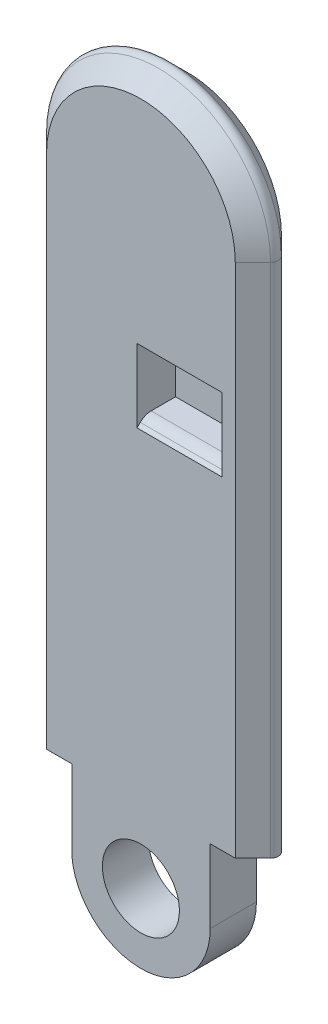
ISO-10303-21;
HEADER;
FILE_DESCRIPTION(('STEP AP214'),'2;1');
FILE_NAME('part.step','',(''),(''),'','','');
FILE_SCHEMA(('AUTOMOTIVE_DESIGN { 1 0 10303 214 1 1 1 1 }'));
ENDSEC;
DATA;
#1=APPLICATION_CONTEXT('core data for automotive mechanical design processes');
#2=APPLICATION_PROTOCOL_DEFINITION('international standard','automotive_design',2000,#1);
#3=PRODUCT_CONTEXT('',#1,'mechanical');
#4=PRODUCT('Part','Part','',(#3));
#5=PRODUCT_RELATED_PRODUCT_CATEGORY('part','',(#4));
#6=PRODUCT_DEFINITION_FORMATION('','',#4);
#7=PRODUCT_DEFINITION_CONTEXT('part definition',#1,'design');
#8=PRODUCT_DEFINITION('design','',#6,#7);
#9=PRODUCT_DEFINITION_SHAPE('','',#8);
#10=(LENGTH_UNIT() NAMED_UNIT(*) SI_UNIT(.MILLI.,.METRE.));
#11=(NAMED_UNIT(*) PLANE_ANGLE_UNIT() SI_UNIT($,.RADIAN.));
#12=(NAMED_UNIT(*) SI_UNIT($,.STERADIAN.) SOLID_ANGLE_UNIT());
#13=UNCERTAINTY_MEASURE_WITH_UNIT(LENGTH_MEASURE(1.E-05),#10,'distance_accuracy_value','');
#14=(GEOMETRIC_REPRESENTATION_CONTEXT(3) GLOBAL_UNCERTAINTY_ASSIGNED_CONTEXT((#13)) GLOBAL_UNIT_ASSIGNED_CONTEXT((#10,
#11,#12)) REPRESENTATION_CONTEXT('',''));
#15=CARTESIAN_POINT('',(0.,0.,0.));
#16=DIRECTION('',(0.,0.,1.));
#17=DIRECTION('',(1.,0.,0.));
#18=AXIS2_PLACEMENT_3D('',#15,#16,#17);
#19=CARTESIAN_POINT('',(0.,0.,-6.));
#20=DIRECTION('',(0.,0.,1.));
#21=DIRECTION('',(1.,0.,0.));
#22=AXIS2_PLACEMENT_3D('',#19,#20,#21);
#23=PLANE('',#22);
#24=CARTESIAN_POINT('',(0.,-43.030823628885,-6.));
#25=DIRECTION('',(0.,0.,1.));
#26=DIRECTION('',(1.,0.,0.));
#27=AXIS2_PLACEMENT_3D('',#24,#25,#26);
#28=CIRCLE('',#27,5.);
#29=CARTESIAN_POINT('',(5.,-43.030823628885,-6.));
#30=VERTEX_POINT('',#29);
#31=EDGE_CURVE('E272',#30,#30,#28,.T.);
#32=ORIENTED_EDGE('',*,*,#31,.T.);
#33=EDGE_LOOP('',(#32));
#34=FACE_BOUND('',#33,.T.);
#35=CARTESIAN_POINT('',(0.,33.5,-6.));
#36=DIRECTION('',(0.,0.,1.));
#37=DIRECTION('',(1.,0.,0.));
#38=AXIS2_PLACEMENT_3D('',#35,#36,#37);
#39=CIRCLE('',#38,12.25);
#40=CARTESIAN_POINT('',(-12.25,33.5,-6.));
#41=VERTEX_POINT('',#40);
#42=CARTESIAN_POINT('',(12.25,33.5,-6.));
#43=VERTEX_POINT('',#42);
#44=EDGE_CURVE('E359',#41,#43,#39,.F.);
#45=ORIENTED_EDGE('',*,*,#44,.T.);
#46=DIRECTION('',(0.,-1.,0.));
#47=VECTOR('',#46,1.);
#48=CARTESIAN_POINT('',(12.25,0.,-6.));
#49=LINE('',#48,#47);
#50=CARTESIAN_POINT('',(12.25,-33.5,-6.));
#51=VERTEX_POINT('',#50);
#52=EDGE_CURVE('E361',#43,#51,#49,.T.);
#53=ORIENTED_EDGE('',*,*,#52,.T.);
#54=DIRECTION('',(1.,0.,0.));
#55=VECTOR('',#54,1.);
#56=CARTESIAN_POINT('',(0.,-33.5,-6.));
#57=LINE('',#56,#55);
#58=CARTESIAN_POINT('',(9.00000000000001,-33.5,-6.));
#59=VERTEX_POINT('',#58);
#60=EDGE_CURVE('E353',#59,#51,#57,.T.);
#61=ORIENTED_EDGE('',*,*,#60,.F.);
#62=DIRECTION('',(0.,1.,0.));
#63=VECTOR('',#62,1.);
#64=CARTESIAN_POINT('',(9.,0.,-6.));
#65=LINE('',#64,#63);
#66=CARTESIAN_POINT('',(9.00000000000001,-43.030823628885,-6.));
#67=VERTEX_POINT('',#66);
#68=EDGE_CURVE('E270',#67,#59,#65,.T.);
#69=ORIENTED_EDGE('',*,*,#68,.F.);
#70=CARTESIAN_POINT('',(0.,-43.030823628885,-6.));
#71=DIRECTION('',(0.,0.,1.));
#72=DIRECTION('',(1.,0.,0.));
#73=AXIS2_PLACEMENT_3D('',#70,#71,#72);
#74=CIRCLE('',#73,9.);
#75=CARTESIAN_POINT('',(-8.97468464942043,-43.7053867789735,-6.));
#76=VERTEX_POINT('',#75);
#77=EDGE_CURVE('E266',#76,#67,#74,.T.);
#78=ORIENTED_EDGE('',*,*,#77,.F.);
#79=DIRECTION('',(0.,-1.,0.));
#80=VECTOR('',#79,1.);
#81=CARTESIAN_POINT('',(-8.97468464942044,0.,-6.));
#82=LINE('',#81,#80);
#83=CARTESIAN_POINT('',(-8.97468464942043,-33.5,-6.));
#84=VERTEX_POINT('',#83);
#85=EDGE_CURVE('E263',#84,#76,#82,.T.);
#86=ORIENTED_EDGE('',*,*,#85,.F.);
#87=CARTESIAN_POINT('',(-12.25,-33.5,-6.));
#88=VERTEX_POINT('',#87);
#89=EDGE_CURVE('E349',#88,#84,#57,.T.);
#90=ORIENTED_EDGE('',*,*,#89,.F.);
#91=DIRECTION('',(0.,1.,0.));
#92=VECTOR('',#91,1.);
#93=CARTESIAN_POINT('',(-12.25,33.5,-6.));
#94=LINE('',#93,#92);
#95=EDGE_CURVE('E352',#88,#41,#94,.T.);
#96=ORIENTED_EDGE('',*,*,#95,.T.);
#97=EDGE_LOOP('',(#45,#53,#61,#69,#78,#86,#90,#96));
#98=FACE_BOUND('',#97,.T.);
#99=DIRECTION('',(0.,-1.,0.));
#100=VECTOR('',#99,1.);
#101=CARTESIAN_POINT('',(-1.5,-31.2388673363516,-6.));
#102=LINE('',#101,#100);
#103=CARTESIAN_POINT('',(-1.5,-24.2388673363516,-6.));
#104=VERTEX_POINT('',#103);
#105=CARTESIAN_POINT('',(-1.5,-31.2388673363516,-6.));
#106=VERTEX_POINT('',#105);
#107=EDGE_CURVE('E307',#104,#106,#102,.T.);
#108=ORIENTED_EDGE('',*,*,#107,.F.);
#109=DIRECTION('',(-1.,0.,0.));
#110=VECTOR('',#109,1.);
#111=CARTESIAN_POINT('',(0.,-24.2388673363516,-6.));
#112=LINE('',#111,#110);
#113=CARTESIAN_POINT('',(-10.5,-24.2388673363516,-6.));
#114=VERTEX_POINT('',#113);
#115=EDGE_CURVE('E418',#104,#114,#112,.T.);
#116=ORIENTED_EDGE('',*,*,#115,.T.);
#117=DIRECTION('',(0.,1.,0.));
#118=VECTOR('',#117,1.);
#119=CARTESIAN_POINT('',(-10.5,-31.2388673363516,-6.));
#120=LINE('',#119,#118);
#121=CARTESIAN_POINT('',(-10.5,-31.2388673363516,-6.));
#122=VERTEX_POINT('',#121);
#123=EDGE_CURVE('E285',#122,#114,#120,.T.);
#124=ORIENTED_EDGE('',*,*,#123,.F.);
#125=DIRECTION('',(-1.,0.,0.));
#126=VECTOR('',#125,1.);
#127=CARTESIAN_POINT('',(-1.5,-31.2388673363516,-6.));
#128=LINE('',#127,#126);
#129=EDGE_CURVE('E296',#106,#122,#128,.T.);
#130=ORIENTED_EDGE('',*,*,#129,.F.);
#131=EDGE_LOOP('',(#108,#116,#124,#130));
#132=FACE_BOUND('',#131,.T.);
#133=DIRECTION('',(1.,0.,0.));
#134=VECTOR('',#133,1.);
#135=CARTESIAN_POINT('',(0.,15.,-6.));
#136=LINE('',#135,#134);
#137=CARTESIAN_POINT('',(0.500000000000004,15.,-6.));
#138=VERTEX_POINT('',#137);
#139=CARTESIAN_POINT('',(4.5,15.,-6.));
#140=VERTEX_POINT('',#139);
#141=EDGE_CURVE('E252',#138,#140,#136,.T.);
#142=ORIENTED_EDGE('',*,*,#141,.F.);
#143=DIRECTION('',(0.,-1.,0.));
#144=VECTOR('',#143,1.);
#145=CARTESIAN_POINT('',(0.500000000000004,0.,-6.));
#146=LINE('',#145,#144);
#147=CARTESIAN_POINT('',(0.500000000000004,8.99999999999999,-6.));
#148=VERTEX_POINT('',#147);
#149=EDGE_CURVE('E248',#138,#148,#146,.T.);
#150=ORIENTED_EDGE('',*,*,#149,.T.);
#151=DIRECTION('',(1.,0.,0.));
#152=VECTOR('',#151,1.);
#153=CARTESIAN_POINT('',(0.,8.99999999999999,-6.));
#154=LINE('',#153,#152);
#155=CARTESIAN_POINT('',(4.5,8.99999999999999,-6.));
#156=VERTEX_POINT('',#155);
#157=EDGE_CURVE('E640',#148,#156,#154,.T.);
#158=ORIENTED_EDGE('',*,*,#157,.T.);
#159=DIRECTION('',(0.,-1.,0.));
#160=VECTOR('',#159,1.);
#161=CARTESIAN_POINT('',(4.5,0.,-6.));
#162=LINE('',#161,#160);
#163=EDGE_CURVE('E642',#140,#156,#162,.T.);
#164=ORIENTED_EDGE('',*,*,#163,.F.);
#165=EDGE_LOOP('',(#142,#150,#158,#164));
#166=FACE_BOUND('',#165,.T.);
#167=ADVANCED_FACE('F45',(#34,#98,#132,#166),#23,.F.);
#168=CARTESIAN_POINT('',(0.,-33.5,-6.));
#169=DIRECTION('',(0.,-1.,0.));
#170=DIRECTION('',(0.,0.,-1.));
#171=AXIS2_PLACEMENT_3D('',#168,#169,#170);
#172=PLANE('',#171);
#173=ORIENTED_EDGE('',*,*,#89,.T.);
#174=DIRECTION('',(0.,0.,1.));
#175=VECTOR('',#174,1.);
#176=CARTESIAN_POINT('',(-8.97468464942043,-33.5,-6.));
#177=LINE('',#176,#175);
#178=CARTESIAN_POINT('',(-8.97468464942043,-33.5,0.));
#179=VERTEX_POINT('',#178);
#180=EDGE_CURVE('E274',#84,#179,#177,.T.);
#181=ORIENTED_EDGE('',*,*,#180,.T.);
#182=DIRECTION('',(1.,0.,0.));
#183=VECTOR('',#182,1.);
#184=CARTESIAN_POINT('',(0.,-33.5,0.));
#185=LINE('',#184,#183);
#186=CARTESIAN_POINT('',(-12.25,-33.5,0.));
#187=VERTEX_POINT('',#186);
#188=EDGE_CURVE('E354',#187,#179,#185,.T.);
#189=ORIENTED_EDGE('',*,*,#188,.F.);
#190=DIRECTION('',(0.707106781186546,0.,0.707106781186549));
#191=VECTOR('',#190,1.);
#192=CARTESIAN_POINT('',(-9.12500000000002,-33.5,3.12499999999998));
#193=LINE('',#192,#191);
#194=CARTESIAN_POINT('',(-14.5428932188134,-33.5,-2.29289321881345));
#195=VERTEX_POINT('',#194);
#196=EDGE_CURVE('E364',#187,#195,#193,.F.);
#197=ORIENTED_EDGE('',*,*,#196,.T.);
#198=CARTESIAN_POINT('',(-13.8357864376269,-33.5,-3.));
#199=DIRECTION('',(0.,-1.,0.));
#200=DIRECTION('',(0.,0.,-1.));
#201=AXIS2_PLACEMENT_3D('',#198,#199,#200);
#202=CIRCLE('',#201,1.);
#203=CARTESIAN_POINT('',(-14.5428932188134,-33.5,-3.70710678118655));
#204=VERTEX_POINT('',#203);
#205=EDGE_CURVE('E397',#195,#204,#202,.T.);
#206=ORIENTED_EDGE('',*,*,#205,.T.);
#207=DIRECTION('',(0.707106781186548,0.,-0.707106781186548));
#208=VECTOR('',#207,1.);
#209=CARTESIAN_POINT('',(-6.12499999999999,-33.5,-12.125));
#210=LINE('',#209,#208);
#211=EDGE_CURVE('E367',#204,#88,#210,.T.);
#212=ORIENTED_EDGE('',*,*,#211,.T.);
#213=EDGE_LOOP('',(#173,#181,#189,#197,#206,#212));
#214=FACE_BOUND('',#213,.T.);
#215=ADVANCED_FACE('F468',(#214),#172,.T.);
#216=DIRECTION('',(0.,0.,1.));
#217=VECTOR('',#216,1.);
#218=CARTESIAN_POINT('',(9.00000000000001,-33.5,-6.));
#219=LINE('',#218,#217);
#220=CARTESIAN_POINT('',(9.00000000000001,-33.5,0.));
#221=VERTEX_POINT('',#220);
#222=EDGE_CURVE('E283',#59,#221,#219,.T.);
#223=ORIENTED_EDGE('',*,*,#222,.F.);
#224=ORIENTED_EDGE('',*,*,#60,.T.);
#225=DIRECTION('',(-0.707106781186548,0.,-0.707106781186548));
#226=VECTOR('',#225,1.);
#227=CARTESIAN_POINT('',(6.12499999999999,-33.5,-12.125));
#228=LINE('',#227,#226);
#229=CARTESIAN_POINT('',(14.5428932188134,-33.5,-3.70710678118654));
#230=VERTEX_POINT('',#229);
#231=EDGE_CURVE('E372',#51,#230,#228,.F.);
#232=ORIENTED_EDGE('',*,*,#231,.T.);
#233=CARTESIAN_POINT('',(13.8357864376269,-33.5,-3.));
#234=DIRECTION('',(0.,-1.,0.));
#235=DIRECTION('',(0.,0.,-1.));
#236=AXIS2_PLACEMENT_3D('',#233,#234,#235);
#237=CIRCLE('',#236,1.);
#238=CARTESIAN_POINT('',(14.5428932188134,-33.5,-2.29289321881345));
#239=VERTEX_POINT('',#238);
#240=EDGE_CURVE('E399',#230,#239,#237,.T.);
#241=ORIENTED_EDGE('',*,*,#240,.T.);
#242=DIRECTION('',(-0.707106781186546,0.,0.707106781186549));
#243=VECTOR('',#242,1.);
#244=CARTESIAN_POINT('',(9.12500000000002,-33.5,3.12499999999999));
#245=LINE('',#244,#243);
#246=CARTESIAN_POINT('',(12.25,-33.5,0.));
#247=VERTEX_POINT('',#246);
#248=EDGE_CURVE('E369',#239,#247,#245,.T.);
#249=ORIENTED_EDGE('',*,*,#248,.T.);
#250=EDGE_CURVE('E357',#221,#247,#185,.T.);
#251=ORIENTED_EDGE('',*,*,#250,.F.);
#252=EDGE_LOOP('',(#223,#224,#232,#241,#249,#251));
#253=FACE_BOUND('',#252,.T.);
#254=ADVANCED_FACE('F476',(#253),#172,.T.);
#255=CARTESIAN_POINT('',(0.,0.,0.));
#256=DIRECTION('',(0.,0.,1.));
#257=DIRECTION('',(1.,0.,0.));
#258=AXIS2_PLACEMENT_3D('',#255,#256,#257);
#259=PLANE('',#258);
#260=DIRECTION('',(0.,1.,0.));
#261=VECTOR('',#260,1.);
#262=CARTESIAN_POINT('',(10.5000000000002,9.50000000000041,0.));
#263=LINE('',#262,#261);
#264=CARTESIAN_POINT('',(10.5000000000002,8.50000000000041,0.));
#265=VERTEX_POINT('',#264);
#266=CARTESIAN_POINT('',(10.5000000000002,18.0000000000004,0.));
#267=VERTEX_POINT('',#266);
#268=EDGE_CURVE('E326',#265,#267,#263,.T.);
#269=ORIENTED_EDGE('',*,*,#268,.F.);
#270=DIRECTION('',(-1.,0.,0.));
#271=VECTOR('',#270,1.);
#272=CARTESIAN_POINT('',(-0.499999999999778,8.50000000000041,0.));
#273=LINE('',#272,#271);
#274=CARTESIAN_POINT('',(-0.499999999999778,8.50000000000041,0.));
#275=VERTEX_POINT('',#274);
#276=EDGE_CURVE('E437',#265,#275,#273,.T.);
#277=ORIENTED_EDGE('',*,*,#276,.T.);
#278=DIRECTION('',(0.,-1.,0.));
#279=VECTOR('',#278,1.);
#280=CARTESIAN_POINT('',(-0.49999999999978,15.0000000000004,0.));
#281=LINE('',#280,#279);
#282=CARTESIAN_POINT('',(-0.49999999999978,18.0000000000004,0.));
#283=VERTEX_POINT('',#282);
#284=EDGE_CURVE('E314',#283,#275,#281,.T.);
#285=ORIENTED_EDGE('',*,*,#284,.F.);
#286=DIRECTION('',(1.,0.,0.));
#287=VECTOR('',#286,1.);
#288=CARTESIAN_POINT('',(10.5000000000002,18.0000000000004,0.));
#289=LINE('',#288,#287);
#290=EDGE_CURVE('E429',#283,#267,#289,.T.);
#291=ORIENTED_EDGE('',*,*,#290,.T.);
#292=EDGE_LOOP('',(#269,#277,#285,#291));
#293=FACE_BOUND('',#292,.T.);
#294=ORIENTED_EDGE('',*,*,#188,.T.);
#295=DIRECTION('',(0.,-1.,0.));
#296=VECTOR('',#295,1.);
#297=CARTESIAN_POINT('',(-8.97468464942044,0.,0.));
#298=LINE('',#297,#296);
#299=CARTESIAN_POINT('',(-8.97468464942043,-43.7053867789735,0.));
#300=VERTEX_POINT('',#299);
#301=EDGE_CURVE('E254',#179,#300,#298,.T.);
#302=ORIENTED_EDGE('',*,*,#301,.T.);
#303=CARTESIAN_POINT('',(0.,-43.030823628885,0.));
#304=DIRECTION('',(0.,0.,1.));
#305=DIRECTION('',(1.,0.,0.));
#306=AXIS2_PLACEMENT_3D('',#303,#304,#305);
#307=CIRCLE('',#306,9.);
#308=CARTESIAN_POINT('',(9.00000000000001,-43.030823628885,0.));
#309=VERTEX_POINT('',#308);
#310=EDGE_CURVE('E257',#300,#309,#307,.T.);
#311=ORIENTED_EDGE('',*,*,#310,.T.);
#312=DIRECTION('',(0.,1.,0.));
#313=VECTOR('',#312,1.);
#314=CARTESIAN_POINT('',(9.,0.,0.));
#315=LINE('',#314,#313);
#316=EDGE_CURVE('E278',#309,#221,#315,.T.);
#317=ORIENTED_EDGE('',*,*,#316,.T.);
#318=ORIENTED_EDGE('',*,*,#250,.T.);
#319=DIRECTION('',(0.,1.,0.));
#320=VECTOR('',#319,1.);
#321=CARTESIAN_POINT('',(12.25,33.5,0.));
#322=LINE('',#321,#320);
#323=CARTESIAN_POINT('',(12.25,33.5,0.));
#324=VERTEX_POINT('',#323);
#325=EDGE_CURVE('E380',#247,#324,#322,.T.);
#326=ORIENTED_EDGE('',*,*,#325,.T.);
#327=CARTESIAN_POINT('',(0.,33.5,0.));
#328=DIRECTION('',(0.,0.,1.));
#329=DIRECTION('',(1.,0.,0.));
#330=AXIS2_PLACEMENT_3D('',#327,#328,#329);
#331=CIRCLE('',#330,12.25);
#332=CARTESIAN_POINT('',(-12.25,33.5,0.));
#333=VERTEX_POINT('',#332);
#334=EDGE_CURVE('E377',#324,#333,#331,.T.);
#335=ORIENTED_EDGE('',*,*,#334,.T.);
#336=DIRECTION('',(0.,-1.,0.));
#337=VECTOR('',#336,1.);
#338=CARTESIAN_POINT('',(-12.25,0.,0.));
#339=LINE('',#338,#337);
#340=EDGE_CURVE('E375',#333,#187,#339,.T.);
#341=ORIENTED_EDGE('',*,*,#340,.T.);
#342=EDGE_LOOP('',(#294,#302,#311,#317,#318,#326,#335,#341));
#343=FACE_BOUND('',#342,.T.);
#344=CARTESIAN_POINT('',(0.,-43.030823628885,0.));
#345=DIRECTION('',(0.,0.,1.));
#346=DIRECTION('',(1.,0.,0.));
#347=AXIS2_PLACEMENT_3D('',#344,#345,#346);
#348=CIRCLE('',#347,5.);
#349=CARTESIAN_POINT('',(5.,-43.030823628885,0.));
#350=VERTEX_POINT('',#349);
#351=EDGE_CURVE('E267',#350,#350,#348,.T.);
#352=ORIENTED_EDGE('',*,*,#351,.F.);
#353=EDGE_LOOP('',(#352));
#354=FACE_BOUND('',#353,.T.);
#355=ADVANCED_FACE('F484',(#293,#343,#354),#259,.T.);
#356=CARTESIAN_POINT('',(-12.25,0.,0.));
#357=DIRECTION('',(0.707106781186549,0.,-0.707106781186546));
#358=DIRECTION('',(0.,-1.,0.));
#359=AXIS2_PLACEMENT_3D('',#356,#357,#358);
#360=PLANE('',#359);
#361=DIRECTION('',(0.707106781186546,0.,0.707106781186549));
#362=VECTOR('',#361,1.);
#363=CARTESIAN_POINT('',(-15.75,33.5,-3.50000000000002));
#364=LINE('',#363,#362);
#365=CARTESIAN_POINT('',(-14.5428932188134,33.5,-2.29289321881345));
#366=VERTEX_POINT('',#365);
#367=EDGE_CURVE('E393',#366,#333,#364,.T.);
#368=ORIENTED_EDGE('',*,*,#367,.F.);
#369=DIRECTION('',(0.,1.,0.));
#370=VECTOR('',#369,1.);
#371=CARTESIAN_POINT('',(-14.5428932188134,0.,-2.29289321881345));
#372=LINE('',#371,#370);
#373=EDGE_CURVE('E409',#366,#195,#372,.F.);
#374=ORIENTED_EDGE('',*,*,#373,.T.);
#375=ORIENTED_EDGE('',*,*,#196,.F.);
#376=ORIENTED_EDGE('',*,*,#340,.F.);
#377=EDGE_LOOP('',(#368,#374,#375,#376));
#378=FACE_BOUND('',#377,.T.);
#379=ADVANCED_FACE('F486',(#378),#360,.F.);
#380=CARTESIAN_POINT('',(0.,33.5,0.));
#381=DIRECTION('',(0.,0.,-1.));
#382=DIRECTION('',(-1.,0.,0.));
#383=AXIS2_PLACEMENT_3D('',#380,#381,#382);
#384=CONICAL_SURFACE('',#383,12.25,0.785398163397446);
#385=DIRECTION('',(-0.707106781186546,0.,0.707106781186549));
#386=VECTOR('',#385,1.);
#387=CARTESIAN_POINT('',(15.75,33.5,-3.50000000000002));
#388=LINE('',#387,#386);
#389=CARTESIAN_POINT('',(14.5428932188134,33.5,-2.29289321881345));
#390=VERTEX_POINT('',#389);
#391=EDGE_CURVE('E391',#390,#324,#388,.T.);
#392=ORIENTED_EDGE('',*,*,#391,.F.);
#393=CARTESIAN_POINT('',(0.,33.5,-2.29289321881345));
#394=DIRECTION('',(0.,0.,1.));
#395=DIRECTION('',(1.,0.,0.));
#396=AXIS2_PLACEMENT_3D('',#393,#394,#395);
#397=CIRCLE('',#396,14.5428932188134);
#398=EDGE_CURVE('E405',#390,#366,#397,.T.);
#399=ORIENTED_EDGE('',*,*,#398,.T.);
#400=ORIENTED_EDGE('',*,*,#367,.T.);
#401=ORIENTED_EDGE('',*,*,#334,.F.);
#402=EDGE_LOOP('',(#392,#399,#400,#401));
#403=FACE_BOUND('',#402,.T.);
#404=ADVANCED_FACE('F521',(#403),#384,.T.);
#405=CARTESIAN_POINT('',(-15.75,0.,-2.49999999999998));
#406=DIRECTION('',(-0.707106781186548,0.,-0.707106781186548));
#407=DIRECTION('',(0.,1.,0.));
#408=AXIS2_PLACEMENT_3D('',#405,#406,#407);
#409=PLANE('',#408);
#410=ORIENTED_EDGE('',*,*,#211,.F.);
#411=DIRECTION('',(0.,-1.,0.));
#412=VECTOR('',#411,1.);
#413=CARTESIAN_POINT('',(-14.5428932188134,0.,-3.70710678118654));
#414=LINE('',#413,#412);
#415=CARTESIAN_POINT('',(-14.5428932188134,33.5,-3.70710678118654));
#416=VERTEX_POINT('',#415);
#417=EDGE_CURVE('E407',#204,#416,#414,.F.);
#418=ORIENTED_EDGE('',*,*,#417,.T.);
#419=DIRECTION('',(-0.707106781186548,0.,0.707106781186548));
#420=VECTOR('',#419,1.);
#421=CARTESIAN_POINT('',(-12.25,33.5,-6.));
#422=LINE('',#421,#420);
#423=EDGE_CURVE('E387',#41,#416,#422,.T.);
#424=ORIENTED_EDGE('',*,*,#423,.F.);
#425=ORIENTED_EDGE('',*,*,#95,.F.);
#426=EDGE_LOOP('',(#410,#418,#424,#425));
#427=FACE_BOUND('',#426,.T.);
#428=ADVANCED_FACE('F514',(#427),#409,.T.);
#429=CARTESIAN_POINT('',(15.75,0.,-3.50000000000002));
#430=DIRECTION('',(0.707106781186549,0.,0.707106781186546));
#431=DIRECTION('',(0.,1.,0.));
#432=AXIS2_PLACEMENT_3D('',#429,#430,#431);
#433=PLANE('',#432);
#434=ORIENTED_EDGE('',*,*,#248,.F.);
#435=DIRECTION('',(0.,1.,0.));
#436=VECTOR('',#435,1.);
#437=CARTESIAN_POINT('',(14.5428932188134,0.,-2.29289321881345));
#438=LINE('',#437,#436);
#439=EDGE_CURVE('E401',#239,#390,#438,.T.);
#440=ORIENTED_EDGE('',*,*,#439,.T.);
#441=ORIENTED_EDGE('',*,*,#391,.T.);
#442=ORIENTED_EDGE('',*,*,#325,.F.);
#443=EDGE_LOOP('',(#434,#440,#441,#442));
#444=FACE_BOUND('',#443,.T.);
#445=ADVANCED_FACE('F507',(#444),#433,.T.);
#446=CARTESIAN_POINT('',(0.,33.5,-2.49999999999998));
#447=DIRECTION('',(0.,0.,1.));
#448=DIRECTION('',(1.,0.,0.));
#449=AXIS2_PLACEMENT_3D('',#446,#447,#448);
#450=CONICAL_SURFACE('',#449,15.75,0.785398163397448);
#451=ORIENTED_EDGE('',*,*,#423,.T.);
#452=CARTESIAN_POINT('',(0.,33.5,-3.70710678118655));
#453=DIRECTION('',(0.,0.,-1.));
#454=DIRECTION('',(-1.,0.,0.));
#455=AXIS2_PLACEMENT_3D('',#452,#453,#454);
#456=CIRCLE('',#455,14.5428932188134);
#457=CARTESIAN_POINT('',(14.5428932188134,33.5,-3.70710678118655));
#458=VERTEX_POINT('',#457);
#459=EDGE_CURVE('E403',#416,#458,#456,.T.);
#460=ORIENTED_EDGE('',*,*,#459,.T.);
#461=DIRECTION('',(0.707106781186548,0.,0.707106781186548));
#462=VECTOR('',#461,1.);
#463=CARTESIAN_POINT('',(12.25,33.5,-6.));
#464=LINE('',#463,#462);
#465=EDGE_CURVE('E384',#43,#458,#464,.T.);
#466=ORIENTED_EDGE('',*,*,#465,.F.);
#467=ORIENTED_EDGE('',*,*,#44,.F.);
#468=EDGE_LOOP('',(#451,#460,#466,#467));
#469=FACE_BOUND('',#468,.T.);
#470=ADVANCED_FACE('F500',(#469),#450,.T.);
#471=CARTESIAN_POINT('',(12.25,0.,-6.));
#472=DIRECTION('',(-0.707106781186548,0.,0.707106781186548));
#473=DIRECTION('',(0.,-1.,0.));
#474=AXIS2_PLACEMENT_3D('',#471,#472,#473);
#475=PLANE('',#474);
#476=ORIENTED_EDGE('',*,*,#465,.T.);
#477=DIRECTION('',(0.,-1.,0.));
#478=VECTOR('',#477,1.);
#479=CARTESIAN_POINT('',(14.5428932188134,0.,-3.70710678118654));
#480=LINE('',#479,#478);
#481=EDGE_CURVE('E383',#458,#230,#480,.T.);
#482=ORIENTED_EDGE('',*,*,#481,.T.);
#483=ORIENTED_EDGE('',*,*,#231,.F.);
#484=ORIENTED_EDGE('',*,*,#52,.F.);
#485=EDGE_LOOP('',(#476,#482,#483,#484));
#486=FACE_BOUND('',#485,.T.);
#487=ADVANCED_FACE('F492',(#486),#475,.F.);
#488=CARTESIAN_POINT('',(-13.8357864376269,0.,-3.));
#489=DIRECTION('',(0.,-1.,0.));
#490=DIRECTION('',(1.,0.,0.));
#491=AXIS2_PLACEMENT_3D('',#488,#489,#490);
#492=CYLINDRICAL_SURFACE('',#491,1.);
#493=ORIENTED_EDGE('',*,*,#205,.F.);
#494=ORIENTED_EDGE('',*,*,#373,.F.);
#495=CARTESIAN_POINT('',(-13.8357864376269,33.5,-3.));
#496=DIRECTION('',(0.,1.,0.));
#497=DIRECTION('',(0.,0.,1.));
#498=AXIS2_PLACEMENT_3D('',#495,#496,#497);
#499=CIRCLE('',#498,1.);
#500=EDGE_CURVE('E388',#416,#366,#499,.T.);
#501=ORIENTED_EDGE('',*,*,#500,.F.);
#502=ORIENTED_EDGE('',*,*,#417,.F.);
#503=EDGE_LOOP('',(#493,#494,#501,#502));
#504=FACE_BOUND('',#503,.T.);
#505=ADVANCED_FACE('F499',(#504),#492,.T.);
#506=CARTESIAN_POINT('',(0.,33.5,-3.));
#507=DIRECTION('',(0.,0.,1.));
#508=DIRECTION('',(1.,0.,0.));
#509=AXIS2_PLACEMENT_3D('',#506,#507,#508);
#510=TOROIDAL_SURFACE('',#509,13.8357864376269,1.);
#511=ORIENTED_EDGE('',*,*,#500,.T.);
#512=ORIENTED_EDGE('',*,*,#398,.F.);
#513=CARTESIAN_POINT('',(13.8357864376269,33.5,-3.));
#514=DIRECTION('',(0.,-1.,0.));
#515=DIRECTION('',(0.,0.,-1.));
#516=AXIS2_PLACEMENT_3D('',#513,#514,#515);
#517=CIRCLE('',#516,1.);
#518=EDGE_CURVE('E341',#458,#390,#517,.T.);
#519=ORIENTED_EDGE('',*,*,#518,.F.);
#520=ORIENTED_EDGE('',*,*,#459,.F.);
#521=EDGE_LOOP('',(#511,#512,#519,#520));
#522=FACE_BOUND('',#521,.T.);
#523=ADVANCED_FACE('F537',(#522),#510,.T.);
#524=CARTESIAN_POINT('',(13.8357864376269,0.,-3.));
#525=DIRECTION('',(0.,1.,0.));
#526=DIRECTION('',(-1.,0.,0.));
#527=AXIS2_PLACEMENT_3D('',#524,#525,#526);
#528=CYLINDRICAL_SURFACE('',#527,1.);
#529=ORIENTED_EDGE('',*,*,#518,.T.);
#530=ORIENTED_EDGE('',*,*,#439,.F.);
#531=ORIENTED_EDGE('',*,*,#240,.F.);
#532=ORIENTED_EDGE('',*,*,#481,.F.);
#533=EDGE_LOOP('',(#529,#530,#531,#532));
#534=FACE_BOUND('',#533,.T.);
#535=ADVANCED_FACE('F534',(#534),#528,.T.);
#536=CARTESIAN_POINT('',(-0.49999999999978,15.0000000000004,-5.));
#537=DIRECTION('',(0.,1.,0.));
#538=DIRECTION('',(0.,0.,1.));
#539=AXIS2_PLACEMENT_3D('',#536,#537,#538);
#540=PLANE('',#539);
#541=DIRECTION('',(0.,0.,1.));
#542=VECTOR('',#541,1.);
#543=CARTESIAN_POINT('',(10.5000000000002,15.0000000000004,-5.));
#544=LINE('',#543,#542);
#545=CARTESIAN_POINT('',(10.5000000000002,15.0000000000004,-5.));
#546=VERTEX_POINT('',#545);
#547=CARTESIAN_POINT('',(10.5000000000002,15.0000000000004,-3.));
#548=VERTEX_POINT('',#547);
#549=EDGE_CURVE('E338',#546,#548,#544,.T.);
#550=ORIENTED_EDGE('',*,*,#549,.T.);
#551=DIRECTION('',(-1.,0.,0.));
#552=VECTOR('',#551,1.);
#553=CARTESIAN_POINT('',(-0.49999999999978,15.0000000000004,-3.));
#554=LINE('',#553,#552);
#555=CARTESIAN_POINT('',(-0.49999999999978,15.0000000000004,-3.));
#556=VERTEX_POINT('',#555);
#557=EDGE_CURVE('E426',#548,#556,#554,.T.);
#558=ORIENTED_EDGE('',*,*,#557,.T.);
#559=DIRECTION('',(0.,0.,1.));
#560=VECTOR('',#559,1.);
#561=CARTESIAN_POINT('',(-0.49999999999978,15.0000000000004,-5.));
#562=LINE('',#561,#560);
#563=CARTESIAN_POINT('',(-0.49999999999978,15.0000000000004,-5.));
#564=VERTEX_POINT('',#563);
#565=EDGE_CURVE('E335',#564,#556,#562,.T.);
#566=ORIENTED_EDGE('',*,*,#565,.F.);
#567=DIRECTION('',(-1.,0.,0.));
#568=VECTOR('',#567,1.);
#569=CARTESIAN_POINT('',(-0.49999999999978,15.0000000000004,-5.));
#570=LINE('',#569,#568);
#571=EDGE_CURVE('E322',#546,#564,#570,.T.);
#572=ORIENTED_EDGE('',*,*,#571,.F.);
#573=EDGE_LOOP('',(#550,#558,#566,#572));
#574=FACE_BOUND('',#573,.T.);
#575=ADVANCED_FACE('F482',(#574),#540,.F.);
#576=CARTESIAN_POINT('',(10.5000000000002,9.50000000000041,-5.));
#577=DIRECTION('',(1.,0.,0.));
#578=DIRECTION('',(0.,0.,-1.));
#579=AXIS2_PLACEMENT_3D('',#576,#577,#578);
#580=PLANE('',#579);
#581=ORIENTED_EDGE('',*,*,#268,.T.);
#582=DIRECTION('',(0.,-0.707106781186549,-0.707106781186546));
#583=VECTOR('',#582,1.);
#584=CARTESIAN_POINT('',(10.5000000000002,11.2500000000004,-6.75));
#585=LINE('',#584,#583);
#586=EDGE_CURVE('E435',#267,#548,#585,.T.);
#587=ORIENTED_EDGE('',*,*,#586,.T.);
#588=ORIENTED_EDGE('',*,*,#549,.F.);
#589=DIRECTION('',(0.,1.,0.));
#590=VECTOR('',#589,1.);
#591=CARTESIAN_POINT('',(10.5000000000002,9.50000000000041,-5.));
#592=LINE('',#591,#590);
#593=CARTESIAN_POINT('',(10.5000000000002,9.50000000000041,-5.));
#594=VERTEX_POINT('',#593);
#595=EDGE_CURVE('E332',#594,#546,#592,.T.);
#596=ORIENTED_EDGE('',*,*,#595,.F.);
#597=DIRECTION('',(0.,0.,1.));
#598=VECTOR('',#597,1.);
#599=CARTESIAN_POINT('',(10.5000000000002,9.50000000000041,-5.));
#600=LINE('',#599,#598);
#601=CARTESIAN_POINT('',(10.5000000000002,9.50000000000041,-1.82842712474619));
#602=VERTEX_POINT('',#601);
#603=EDGE_CURVE('E342',#594,#602,#600,.T.);
#604=ORIENTED_EDGE('',*,*,#603,.T.);
#605=CARTESIAN_POINT('',(10.5000000000002,7.50000000000041,-1.82842712474619));
#606=DIRECTION('',(1.,0.,0.));
#607=DIRECTION('',(0.,0.,-1.));
#608=AXIS2_PLACEMENT_3D('',#605,#606,#607);
#609=CIRCLE('',#608,2.);
#610=CARTESIAN_POINT('',(10.5000000000002,8.91421356237351,-0.414213562373096));
#611=VERTEX_POINT('',#610);
#612=EDGE_CURVE('E53',#602,#611,#609,.T.);
#613=ORIENTED_EDGE('',*,*,#612,.T.);
#614=DIRECTION('',(0.,-0.707106781186548,0.707106781186548));
#615=VECTOR('',#614,1.);
#616=CARTESIAN_POINT('',(10.5000000000002,11.5000000000004,-3.));
#617=LINE('',#616,#615);
#618=EDGE_CURVE('E440',#611,#265,#617,.T.);
#619=ORIENTED_EDGE('',*,*,#618,.T.);
#620=EDGE_LOOP('',(#581,#587,#588,#596,#604,#613,#619));
#621=FACE_BOUND('',#620,.T.);
#622=ADVANCED_FACE('F454',(#621),#580,.F.);
#623=CARTESIAN_POINT('',(-0.499999999999778,9.50000000000041,-5.));
#624=DIRECTION('',(0.,-1.,0.));
#625=DIRECTION('',(1.,0.,0.));
#626=AXIS2_PLACEMENT_3D('',#623,#624,#625);
#627=PLANE('',#626);
#628=DIRECTION('',(0.,0.,1.));
#629=VECTOR('',#628,1.);
#630=CARTESIAN_POINT('',(-0.499999999999778,9.50000000000041,-5.));
#631=LINE('',#630,#629);
#632=CARTESIAN_POINT('',(-0.499999999999778,9.50000000000041,-5.));
#633=VERTEX_POINT('',#632);
#634=CARTESIAN_POINT('',(-0.499999999999778,9.50000000000041,-1.82842712474619));
#635=VERTEX_POINT('',#634);
#636=EDGE_CURVE('E344',#633,#635,#631,.T.);
#637=ORIENTED_EDGE('',*,*,#636,.T.);
#638=DIRECTION('',(1.,0.,0.));
#639=VECTOR('',#638,1.);
#640=CARTESIAN_POINT('',(10.5000000000002,9.50000000000041,-1.82842712474619));
#641=LINE('',#640,#639);
#642=EDGE_CURVE('E444',#635,#602,#641,.T.);
#643=ORIENTED_EDGE('',*,*,#642,.T.);
#644=ORIENTED_EDGE('',*,*,#603,.F.);
#645=DIRECTION('',(1.,0.,0.));
#646=VECTOR('',#645,1.);
#647=CARTESIAN_POINT('',(-0.499999999999778,9.50000000000041,-5.));
#648=LINE('',#647,#646);
#649=EDGE_CURVE('E329',#633,#594,#648,.T.);
#650=ORIENTED_EDGE('',*,*,#649,.F.);
#651=EDGE_LOOP('',(#637,#643,#644,#650));
#652=FACE_BOUND('',#651,.T.);
#653=ADVANCED_FACE('F449',(#652),#627,.F.);
#654=CARTESIAN_POINT('',(-0.49999999999978,15.0000000000004,-5.));
#655=DIRECTION('',(-1.,0.,0.));
#656=DIRECTION('',(0.,-1.,0.));
#657=AXIS2_PLACEMENT_3D('',#654,#655,#656);
#658=PLANE('',#657);
#659=ORIENTED_EDGE('',*,*,#284,.T.);
#660=DIRECTION('',(0.,0.707106781186548,-0.707106781186548));
#661=VECTOR('',#660,1.);
#662=CARTESIAN_POINT('',(-0.499999999999779,14.2500000000004,-5.75));
#663=LINE('',#662,#661);
#664=CARTESIAN_POINT('',(-0.499999999999778,8.91421356237351,-0.414213562373095));
#665=VERTEX_POINT('',#664);
#666=EDGE_CURVE('E442',#275,#665,#663,.T.);
#667=ORIENTED_EDGE('',*,*,#666,.T.);
#668=CARTESIAN_POINT('',(-0.499999999999778,7.50000000000041,-1.82842712474619));
#669=DIRECTION('',(-1.,0.,0.));
#670=DIRECTION('',(0.,-1.,0.));
#671=AXIS2_PLACEMENT_3D('',#668,#669,#670);
#672=CIRCLE('',#671,2.);
#673=EDGE_CURVE('E11',#665,#635,#672,.T.);
#674=ORIENTED_EDGE('',*,*,#673,.T.);
#675=ORIENTED_EDGE('',*,*,#636,.F.);
#676=DIRECTION('',(0.,-1.,0.));
#677=VECTOR('',#676,1.);
#678=CARTESIAN_POINT('',(-0.49999999999978,15.0000000000004,-5.));
#679=LINE('',#678,#677);
#680=EDGE_CURVE('E325',#564,#633,#679,.T.);
#681=ORIENTED_EDGE('',*,*,#680,.F.);
#682=ORIENTED_EDGE('',*,*,#565,.T.);
#683=DIRECTION('',(0.,0.707106781186549,0.707106781186546));
#684=VECTOR('',#683,1.);
#685=CARTESIAN_POINT('',(-0.499999999999779,14.0000000000004,-4.));
#686=LINE('',#685,#684);
#687=EDGE_CURVE('E432',#556,#283,#686,.T.);
#688=ORIENTED_EDGE('',*,*,#687,.T.);
#689=EDGE_LOOP('',(#659,#667,#674,#675,#681,#682,#688));
#690=FACE_BOUND('',#689,.T.);
#691=ADVANCED_FACE('F460',(#690),#658,.F.);
#692=CARTESIAN_POINT('',(0.,0.,-5.));
#693=DIRECTION('',(0.,0.,1.));
#694=DIRECTION('',(1.,0.,0.));
#695=AXIS2_PLACEMENT_3D('',#692,#693,#694);
#696=PLANE('',#695);
#697=ORIENTED_EDGE('',*,*,#571,.T.);
#698=ORIENTED_EDGE('',*,*,#680,.T.);
#699=ORIENTED_EDGE('',*,*,#649,.T.);
#700=ORIENTED_EDGE('',*,*,#595,.T.);
#701=EDGE_LOOP('',(#697,#698,#699,#700));
#702=FACE_BOUND('',#701,.T.);
#703=ADVANCED_FACE('F457',(#702),#696,.T.);
#704=CARTESIAN_POINT('',(-10.5,-31.2388673363516,-1.5));
#705=DIRECTION('',(-1.,0.,0.));
#706=DIRECTION('',(0.,0.,1.));
#707=AXIS2_PLACEMENT_3D('',#704,#705,#706);
#708=PLANE('',#707);
#709=ORIENTED_EDGE('',*,*,#123,.T.);
#710=DIRECTION('',(0.,0.707106781186552,-0.707106781186543));
#711=VECTOR('',#710,1.);
#712=CARTESIAN_POINT('',(-10.5,-29.9888673363517,-0.250000000000035));
#713=LINE('',#712,#711);
#714=CARTESIAN_POINT('',(-10.5,-24.7388673363516,-5.50000000000001));
#715=VERTEX_POINT('',#714);
#716=EDGE_CURVE('E424',#114,#715,#713,.F.);
#717=ORIENTED_EDGE('',*,*,#716,.T.);
#718=DIRECTION('',(0.,0.,-1.));
#719=VECTOR('',#718,1.);
#720=CARTESIAN_POINT('',(-10.5,-24.7388673363516,-1.5));
#721=LINE('',#720,#719);
#722=CARTESIAN_POINT('',(-10.5,-24.7388673363516,-1.5));
#723=VERTEX_POINT('',#722);
#724=EDGE_CURVE('E305',#723,#715,#721,.T.);
#725=ORIENTED_EDGE('',*,*,#724,.F.);
#726=DIRECTION('',(0.,1.,0.));
#727=VECTOR('',#726,1.);
#728=CARTESIAN_POINT('',(-10.5,-31.2388673363516,-1.5));
#729=LINE('',#728,#727);
#730=CARTESIAN_POINT('',(-10.5,-31.2388673363516,-1.5));
#731=VERTEX_POINT('',#730);
#732=EDGE_CURVE('E292',#731,#723,#729,.T.);
#733=ORIENTED_EDGE('',*,*,#732,.F.);
#734=DIRECTION('',(0.,0.,-1.));
#735=VECTOR('',#734,1.);
#736=CARTESIAN_POINT('',(-10.5,-31.2388673363516,-1.5));
#737=LINE('',#736,#735);
#738=EDGE_CURVE('E312',#731,#122,#737,.T.);
#739=ORIENTED_EDGE('',*,*,#738,.T.);
#740=EDGE_LOOP('',(#709,#717,#725,#733,#739));
#741=FACE_BOUND('',#740,.T.);
#742=ADVANCED_FACE('F586',(#741),#708,.F.);
#743=CARTESIAN_POINT('',(-1.5,-31.2388673363516,-1.5));
#744=DIRECTION('',(0.,-1.,0.));
#745=DIRECTION('',(0.,0.,-1.));
#746=AXIS2_PLACEMENT_3D('',#743,#744,#745);
#747=PLANE('',#746);
#748=ORIENTED_EDGE('',*,*,#129,.T.);
#749=ORIENTED_EDGE('',*,*,#738,.F.);
#750=DIRECTION('',(-1.,0.,0.));
#751=VECTOR('',#750,1.);
#752=CARTESIAN_POINT('',(-1.5,-31.2388673363516,-1.5));
#753=LINE('',#752,#751);
#754=CARTESIAN_POINT('',(-1.5,-31.2388673363516,-1.5));
#755=VERTEX_POINT('',#754);
#756=EDGE_CURVE('E302',#755,#731,#753,.T.);
#757=ORIENTED_EDGE('',*,*,#756,.F.);
#758=DIRECTION('',(0.,0.,-1.));
#759=VECTOR('',#758,1.);
#760=CARTESIAN_POINT('',(-1.5,-31.2388673363516,-1.5));
#761=LINE('',#760,#759);
#762=EDGE_CURVE('E315',#755,#106,#761,.T.);
#763=ORIENTED_EDGE('',*,*,#762,.T.);
#764=EDGE_LOOP('',(#748,#749,#757,#763));
#765=FACE_BOUND('',#764,.T.);
#766=ADVANCED_FACE('F591',(#765),#747,.F.);
#767=CARTESIAN_POINT('',(-1.5,-31.2388673363516,-1.5));
#768=DIRECTION('',(1.,0.,0.));
#769=DIRECTION('',(0.,0.,-1.));
#770=AXIS2_PLACEMENT_3D('',#767,#768,#769);
#771=PLANE('',#770);
#772=ORIENTED_EDGE('',*,*,#107,.T.);
#773=ORIENTED_EDGE('',*,*,#762,.F.);
#774=DIRECTION('',(0.,-1.,0.));
#775=VECTOR('',#774,1.);
#776=CARTESIAN_POINT('',(-1.5,-31.2388673363516,-1.5));
#777=LINE('',#776,#775);
#778=CARTESIAN_POINT('',(-1.5,-24.7388673363516,-1.5));
#779=VERTEX_POINT('',#778);
#780=EDGE_CURVE('E299',#779,#755,#777,.T.);
#781=ORIENTED_EDGE('',*,*,#780,.F.);
#782=DIRECTION('',(0.,0.,-1.));
#783=VECTOR('',#782,1.);
#784=CARTESIAN_POINT('',(-1.5,-24.7388673363516,-1.5));
#785=LINE('',#784,#783);
#786=CARTESIAN_POINT('',(-1.5,-24.7388673363516,-5.50000000000001));
#787=VERTEX_POINT('',#786);
#788=EDGE_CURVE('E317',#779,#787,#785,.T.);
#789=ORIENTED_EDGE('',*,*,#788,.T.);
#790=DIRECTION('',(0.,-0.707106781186552,0.707106781186543));
#791=VECTOR('',#790,1.);
#792=CARTESIAN_POINT('',(-1.5,-29.9888673363517,-0.250000000000035));
#793=LINE('',#792,#791);
#794=EDGE_CURVE('E421',#787,#104,#793,.F.);
#795=ORIENTED_EDGE('',*,*,#794,.T.);
#796=EDGE_LOOP('',(#772,#773,#781,#789,#795));
#797=FACE_BOUND('',#796,.T.);
#798=ADVANCED_FACE('F597',(#797),#771,.F.);
#799=CARTESIAN_POINT('',(-1.5,-24.7388673363516,-1.5));
#800=DIRECTION('',(0.,1.,0.));
#801=DIRECTION('',(0.,0.,1.));
#802=AXIS2_PLACEMENT_3D('',#799,#800,#801);
#803=PLANE('',#802);
#804=ORIENTED_EDGE('',*,*,#724,.T.);
#805=DIRECTION('',(1.,0.,0.));
#806=VECTOR('',#805,1.);
#807=CARTESIAN_POINT('',(-1.5,-24.7388673363516,-5.50000000000001));
#808=LINE('',#807,#806);
#809=EDGE_CURVE('E411',#715,#787,#808,.T.);
#810=ORIENTED_EDGE('',*,*,#809,.T.);
#811=ORIENTED_EDGE('',*,*,#788,.F.);
#812=DIRECTION('',(1.,0.,0.));
#813=VECTOR('',#812,1.);
#814=CARTESIAN_POINT('',(-1.5,-24.7388673363516,-1.5));
#815=LINE('',#814,#813);
#816=EDGE_CURVE('E295',#723,#779,#815,.T.);
#817=ORIENTED_EDGE('',*,*,#816,.F.);
#818=EDGE_LOOP('',(#804,#810,#811,#817));
#819=FACE_BOUND('',#818,.T.);
#820=ADVANCED_FACE('F601',(#819),#803,.F.);
#821=CARTESIAN_POINT('',(0.,0.,-1.5));
#822=DIRECTION('',(0.,0.,1.));
#823=DIRECTION('',(1.,0.,0.));
#824=AXIS2_PLACEMENT_3D('',#821,#822,#823);
#825=PLANE('',#824);
#826=ORIENTED_EDGE('',*,*,#732,.T.);
#827=ORIENTED_EDGE('',*,*,#816,.T.);
#828=ORIENTED_EDGE('',*,*,#780,.T.);
#829=ORIENTED_EDGE('',*,*,#756,.T.);
#830=EDGE_LOOP('',(#826,#827,#828,#829));
#831=FACE_BOUND('',#830,.T.);
#832=ADVANCED_FACE('F552',(#831),#825,.F.);
#833=CARTESIAN_POINT('',(-1.5,-24.7388673363516,-5.50000000000001));
#834=DIRECTION('',(0.,0.707106781186543,0.707106781186552));
#835=DIRECTION('',(1.,0.,0.));
#836=AXIS2_PLACEMENT_3D('',#833,#834,#835);
#837=PLANE('',#836);
#838=ORIENTED_EDGE('',*,*,#716,.F.);
#839=ORIENTED_EDGE('',*,*,#115,.F.);
#840=ORIENTED_EDGE('',*,*,#794,.F.);
#841=ORIENTED_EDGE('',*,*,#809,.F.);
#842=EDGE_LOOP('',(#838,#839,#840,#841));
#843=FACE_BOUND('',#842,.T.);
#844=ADVANCED_FACE('F545',(#843),#837,.F.);
#845=CARTESIAN_POINT('',(9.,0.,-6.));
#846=DIRECTION('',(1.,0.,0.));
#847=DIRECTION('',(0.,1.,0.));
#848=AXIS2_PLACEMENT_3D('',#845,#846,#847);
#849=PLANE('',#848);
#850=ORIENTED_EDGE('',*,*,#316,.F.);
#851=DIRECTION('',(0.,0.,1.));
#852=VECTOR('',#851,1.);
#853=CARTESIAN_POINT('',(9.00000000000001,-43.030823628885,-6.));
#854=LINE('',#853,#852);
#855=EDGE_CURVE('E286',#67,#309,#854,.T.);
#856=ORIENTED_EDGE('',*,*,#855,.F.);
#857=ORIENTED_EDGE('',*,*,#68,.T.);
#858=ORIENTED_EDGE('',*,*,#222,.T.);
#859=EDGE_LOOP('',(#850,#856,#857,#858));
#860=FACE_BOUND('',#859,.T.);
#861=ADVANCED_FACE('F551',(#860),#849,.T.);
#862=CARTESIAN_POINT('',(0.,-43.030823628885,-6.));
#863=DIRECTION('',(0.,0.,1.));
#864=DIRECTION('',(1.,0.,0.));
#865=AXIS2_PLACEMENT_3D('',#862,#863,#864);
#866=CYLINDRICAL_SURFACE('',#865,9.);
#867=ORIENTED_EDGE('',*,*,#310,.F.);
#868=DIRECTION('',(0.,0.,1.));
#869=VECTOR('',#868,1.);
#870=CARTESIAN_POINT('',(-8.97468464942043,-43.7053867789735,-6.));
#871=LINE('',#870,#869);
#872=EDGE_CURVE('E288',#76,#300,#871,.T.);
#873=ORIENTED_EDGE('',*,*,#872,.F.);
#874=ORIENTED_EDGE('',*,*,#77,.T.);
#875=ORIENTED_EDGE('',*,*,#855,.T.);
#876=EDGE_LOOP('',(#867,#873,#874,#875));
#877=FACE_BOUND('',#876,.T.);
#878=ADVANCED_FACE('F613',(#877),#866,.T.);
#879=CARTESIAN_POINT('',(-8.97468464942044,0.,-6.));
#880=DIRECTION('',(-1.,0.,0.));
#881=DIRECTION('',(0.,-1.,0.));
#882=AXIS2_PLACEMENT_3D('',#879,#880,#881);
#883=PLANE('',#882);
#884=ORIENTED_EDGE('',*,*,#301,.F.);
#885=ORIENTED_EDGE('',*,*,#180,.F.);
#886=ORIENTED_EDGE('',*,*,#85,.T.);
#887=ORIENTED_EDGE('',*,*,#872,.T.);
#888=EDGE_LOOP('',(#884,#885,#886,#887));
#889=FACE_BOUND('',#888,.T.);
#890=ADVANCED_FACE('F609',(#889),#883,.T.);
#891=CARTESIAN_POINT('',(0.,-43.030823628885,-6.));
#892=DIRECTION('',(0.,0.,1.));
#893=DIRECTION('',(1.,0.,0.));
#894=AXIS2_PLACEMENT_3D('',#891,#892,#893);
#895=CYLINDRICAL_SURFACE('',#894,5.);
#896=ORIENTED_EDGE('',*,*,#31,.F.);
#897=EDGE_LOOP('',(#896));
#898=FACE_BOUND('',#897,.T.);
#899=ORIENTED_EDGE('',*,*,#351,.T.);
#900=EDGE_LOOP('',(#899));
#901=FACE_BOUND('',#900,.T.);
#902=ADVANCED_FACE('F612',(#898,#901),#895,.F.);
#903=CARTESIAN_POINT('',(0.,15.,-10.5));
#904=DIRECTION('',(0.,-1.,0.));
#905=DIRECTION('',(0.,0.,-1.));
#906=AXIS2_PLACEMENT_3D('',#903,#904,#905);
#907=PLANE('',#906);
#908=ORIENTED_EDGE('',*,*,#141,.T.);
#909=DIRECTION('',(0.,0.,1.));
#910=VECTOR('',#909,1.);
#911=CARTESIAN_POINT('',(4.5,15.,-10.5));
#912=LINE('',#911,#910);
#913=CARTESIAN_POINT('',(4.5,15.,-10.5));
#914=VERTEX_POINT('',#913);
#915=EDGE_CURVE('E233',#914,#140,#912,.T.);
#916=ORIENTED_EDGE('',*,*,#915,.F.);
#917=DIRECTION('',(1.,0.,0.));
#918=VECTOR('',#917,1.);
#919=CARTESIAN_POINT('',(0.,15.,-10.5));
#920=LINE('',#919,#918);
#921=CARTESIAN_POINT('',(0.500000000000004,15.,-10.5));
#922=VERTEX_POINT('',#921);
#923=EDGE_CURVE('E240',#922,#914,#920,.T.);
#924=ORIENTED_EDGE('',*,*,#923,.F.);
#925=DIRECTION('',(0.,0.,1.));
#926=VECTOR('',#925,1.);
#927=CARTESIAN_POINT('',(0.500000000000004,15.,-10.5));
#928=LINE('',#927,#926);
#929=EDGE_CURVE('E637',#922,#138,#928,.T.);
#930=ORIENTED_EDGE('',*,*,#929,.T.);
#931=EDGE_LOOP('',(#908,#916,#924,#930));
#932=FACE_BOUND('',#931,.T.);
#933=ADVANCED_FACE('F250',(#932),#907,.F.);
#934=CARTESIAN_POINT('',(4.5,0.,-10.5));
#935=DIRECTION('',(-1.,0.,0.));
#936=DIRECTION('',(0.,0.,1.));
#937=AXIS2_PLACEMENT_3D('',#934,#935,#936);
#938=PLANE('',#937);
#939=ORIENTED_EDGE('',*,*,#163,.T.);
#940=DIRECTION('',(0.,0.,1.));
#941=VECTOR('',#940,1.);
#942=CARTESIAN_POINT('',(4.5,8.99999999999999,-10.5));
#943=LINE('',#942,#941);
#944=CARTESIAN_POINT('',(4.5,8.99999999999999,-10.5));
#945=VERTEX_POINT('',#944);
#946=EDGE_CURVE('E235',#945,#156,#943,.T.);
#947=ORIENTED_EDGE('',*,*,#946,.F.);
#948=DIRECTION('',(0.,-1.,0.));
#949=VECTOR('',#948,1.);
#950=CARTESIAN_POINT('',(4.5,0.,-10.5));
#951=LINE('',#950,#949);
#952=EDGE_CURVE('E228',#914,#945,#951,.T.);
#953=ORIENTED_EDGE('',*,*,#952,.F.);
#954=ORIENTED_EDGE('',*,*,#915,.T.);
#955=EDGE_LOOP('',(#939,#947,#953,#954));
#956=FACE_BOUND('',#955,.T.);
#957=ADVANCED_FACE('F231',(#956),#938,.F.);
#958=CARTESIAN_POINT('',(0.,8.99999999999999,-10.5));
#959=DIRECTION('',(0.,-1.,0.));
#960=DIRECTION('',(0.,0.,-1.));
#961=AXIS2_PLACEMENT_3D('',#958,#959,#960);
#962=PLANE('',#961);
#963=ORIENTED_EDGE('',*,*,#157,.F.);
#964=DIRECTION('',(0.,0.,1.));
#965=VECTOR('',#964,1.);
#966=CARTESIAN_POINT('',(0.500000000000004,8.99999999999999,-10.5));
#967=LINE('',#966,#965);
#968=CARTESIAN_POINT('',(0.500000000000004,8.99999999999999,-10.5));
#969=VERTEX_POINT('',#968);
#970=EDGE_CURVE('E259',#969,#148,#967,.T.);
#971=ORIENTED_EDGE('',*,*,#970,.F.);
#972=DIRECTION('',(1.,0.,0.));
#973=VECTOR('',#972,1.);
#974=CARTESIAN_POINT('',(0.,8.99999999999999,-10.5));
#975=LINE('',#974,#973);
#976=EDGE_CURVE('E239',#969,#945,#975,.T.);
#977=ORIENTED_EDGE('',*,*,#976,.T.);
#978=ORIENTED_EDGE('',*,*,#946,.T.);
#979=EDGE_LOOP('',(#963,#971,#977,#978));
#980=FACE_BOUND('',#979,.T.);
#981=ADVANCED_FACE('F626',(#980),#962,.T.);
#982=CARTESIAN_POINT('',(0.500000000000004,0.,-10.5));
#983=DIRECTION('',(-1.,0.,0.));
#984=DIRECTION('',(0.,0.,1.));
#985=AXIS2_PLACEMENT_3D('',#982,#983,#984);
#986=PLANE('',#985);
#987=ORIENTED_EDGE('',*,*,#149,.F.);
#988=ORIENTED_EDGE('',*,*,#929,.F.);
#989=DIRECTION('',(0.,-1.,0.));
#990=VECTOR('',#989,1.);
#991=CARTESIAN_POINT('',(0.500000000000004,0.,-10.5));
#992=LINE('',#991,#990);
#993=EDGE_CURVE('E246',#922,#969,#992,.T.);
#994=ORIENTED_EDGE('',*,*,#993,.T.);
#995=ORIENTED_EDGE('',*,*,#970,.T.);
#996=EDGE_LOOP('',(#987,#988,#994,#995));
#997=FACE_BOUND('',#996,.T.);
#998=ADVANCED_FACE('F565',(#997),#986,.T.);
#999=CARTESIAN_POINT('',(0.,0.,-10.5));
#1000=DIRECTION('',(0.,0.,-1.));
#1001=DIRECTION('',(-1.,0.,0.));
#1002=AXIS2_PLACEMENT_3D('',#999,#1000,#1001);
#1003=PLANE('',#1002);
#1004=ORIENTED_EDGE('',*,*,#923,.T.);
#1005=ORIENTED_EDGE('',*,*,#952,.T.);
#1006=ORIENTED_EDGE('',*,*,#976,.F.);
#1007=ORIENTED_EDGE('',*,*,#993,.F.);
#1008=EDGE_LOOP('',(#1004,#1005,#1006,#1007));
#1009=FACE_BOUND('',#1008,.T.);
#1010=ADVANCED_FACE('F244',(#1009),#1003,.T.);
#1011=CARTESIAN_POINT('',(-0.49999999999978,15.0000000000004,-3.));
#1012=DIRECTION('',(0.,-0.707106781186546,0.707106781186549));
#1013=DIRECTION('',(1.,0.,0.));
#1014=AXIS2_PLACEMENT_3D('',#1011,#1012,#1013);
#1015=PLANE('',#1014);
#1016=ORIENTED_EDGE('',*,*,#586,.F.);
#1017=ORIENTED_EDGE('',*,*,#290,.F.);
#1018=ORIENTED_EDGE('',*,*,#687,.F.);
#1019=ORIENTED_EDGE('',*,*,#557,.F.);
#1020=EDGE_LOOP('',(#1016,#1017,#1018,#1019));
#1021=FACE_BOUND('',#1020,.T.);
#1022=ADVANCED_FACE('F466',(#1021),#1015,.T.);
#1023=CARTESIAN_POINT('',(-0.499999999999778,9.50000000000041,-1.));
#1024=DIRECTION('',(0.,0.707106781186547,0.707106781186547));
#1025=DIRECTION('',(-1.,0.,0.));
#1026=AXIS2_PLACEMENT_3D('',#1023,#1024,#1025);
#1027=PLANE('',#1026);
#1028=ORIENTED_EDGE('',*,*,#618,.F.);
#1029=DIRECTION('',(1.,0.,0.));
#1030=VECTOR('',#1029,1.);
#1031=CARTESIAN_POINT('',(-0.499999999999778,8.91421356237351,-0.414213562373096));
#1032=LINE('',#1031,#1030);
#1033=EDGE_CURVE('E66',#611,#665,#1032,.F.);
#1034=ORIENTED_EDGE('',*,*,#1033,.T.);
#1035=ORIENTED_EDGE('',*,*,#666,.F.);
#1036=ORIENTED_EDGE('',*,*,#276,.F.);
#1037=EDGE_LOOP('',(#1028,#1034,#1035,#1036));
#1038=FACE_BOUND('',#1037,.T.);
#1039=ADVANCED_FACE('F462',(#1038),#1027,.T.);
#1040=CARTESIAN_POINT('',(-0.499999999999778,7.50000000000041,-1.82842712474619));
#1041=DIRECTION('',(-1.,0.,0.));
#1042=DIRECTION('',(0.,-1.,0.));
#1043=AXIS2_PLACEMENT_3D('',#1040,#1041,#1042);
#1044=CYLINDRICAL_SURFACE('',#1043,2.);
#1045=ORIENTED_EDGE('',*,*,#673,.F.);
#1046=ORIENTED_EDGE('',*,*,#1033,.F.);
#1047=ORIENTED_EDGE('',*,*,#612,.F.);
#1048=ORIENTED_EDGE('',*,*,#642,.F.);
#1049=EDGE_LOOP('',(#1045,#1046,#1047,#1048));
#1050=FACE_BOUND('',#1049,.T.);
#1051=ADVANCED_FACE('F47',(#1050),#1044,.T.);
#1052=CLOSED_SHELL('',(#167,#215,#254,#355,#379,#404,#428,#445,#470,#487,#505,#523,#535,#575,
#622,#653,#691,#703,#742,#766,#798,#820,#832,#844,#861,#878,#890,#902,#933,#957,#981,#998,#1010,
#1022,#1039,#1051));
#1053=MANIFOLD_SOLID_BREP('B2',#1052);
#1054=ADVANCED_BREP_SHAPE_REPRESENTATION('',(#18,#1053),#14);
#1055=SHAPE_DEFINITION_REPRESENTATION(#9,#1054);
ENDSEC;
END-ISO-10303-21;
